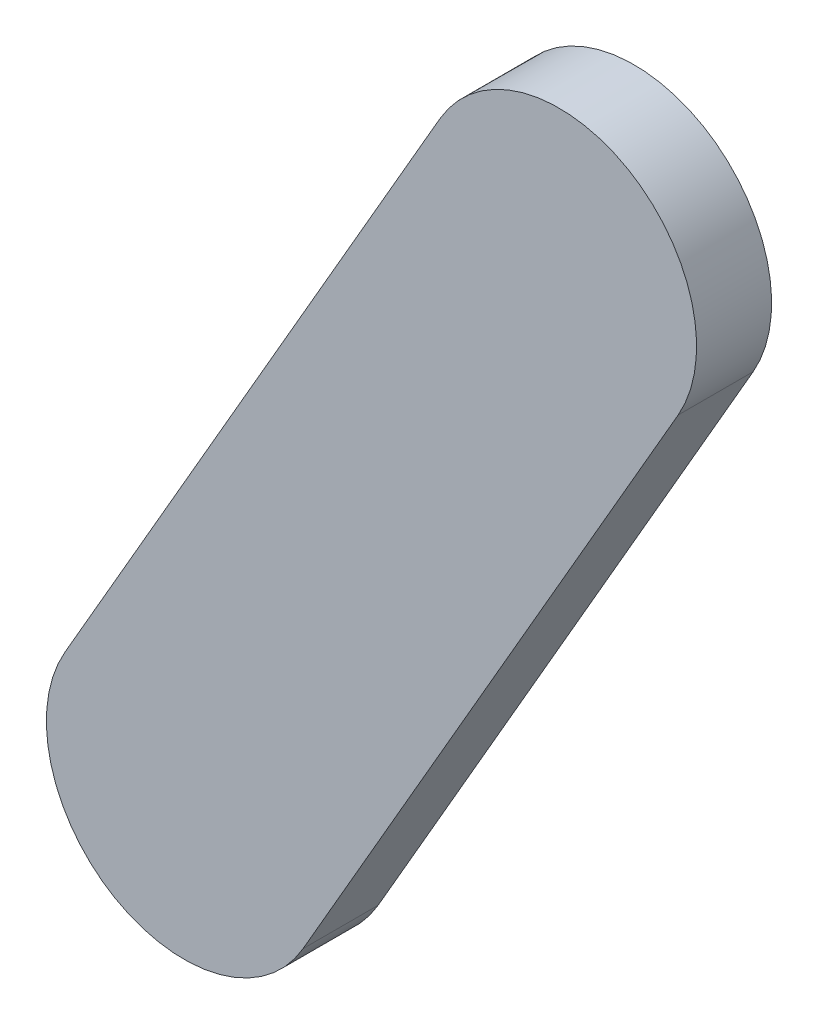
ISO-10303-21;
HEADER;
FILE_DESCRIPTION(('STEP AP214'),'2;1');
FILE_NAME('part.step','',(''),(''),'','','');
FILE_SCHEMA(('AUTOMOTIVE_DESIGN { 1 0 10303 214 1 1 1 1 }'));
ENDSEC;
DATA;
#1=APPLICATION_CONTEXT('core data for automotive mechanical design processes');
#2=APPLICATION_PROTOCOL_DEFINITION('international standard','automotive_design',2000,#1);
#3=PRODUCT_CONTEXT('',#1,'mechanical');
#4=PRODUCT('Part','Part','',(#3));
#5=PRODUCT_RELATED_PRODUCT_CATEGORY('part','',(#4));
#6=PRODUCT_DEFINITION_FORMATION('','',#4);
#7=PRODUCT_DEFINITION_CONTEXT('part definition',#1,'design');
#8=PRODUCT_DEFINITION('design','',#6,#7);
#9=PRODUCT_DEFINITION_SHAPE('','',#8);
#10=(LENGTH_UNIT() NAMED_UNIT(*) SI_UNIT(.MILLI.,.METRE.));
#11=(NAMED_UNIT(*) PLANE_ANGLE_UNIT() SI_UNIT($,.RADIAN.));
#12=(NAMED_UNIT(*) SI_UNIT($,.STERADIAN.) SOLID_ANGLE_UNIT());
#13=UNCERTAINTY_MEASURE_WITH_UNIT(LENGTH_MEASURE(1.E-05),#10,'distance_accuracy_value','');
#14=(GEOMETRIC_REPRESENTATION_CONTEXT(3) GLOBAL_UNCERTAINTY_ASSIGNED_CONTEXT((#13)) GLOBAL_UNIT_ASSIGNED_CONTEXT((#10,
#11,#12)) REPRESENTATION_CONTEXT('',''));
#15=CARTESIAN_POINT('',(0.,0.,0.));
#16=DIRECTION('',(0.,0.,1.));
#17=DIRECTION('',(1.,0.,0.));
#18=AXIS2_PLACEMENT_3D('',#15,#16,#17);
#19=CARTESIAN_POINT('',(0.,0.,1.5));
#20=DIRECTION('',(0.,0.,-1.));
#21=DIRECTION('',(-1.,0.,0.));
#22=AXIS2_PLACEMENT_3D('',#19,#20,#21);
#23=CYLINDRICAL_SURFACE('',#22,5.5);
#24=CARTESIAN_POINT('',(0.,0.,-1.5));
#25=DIRECTION('',(0.,0.,1.));
#26=DIRECTION('',(1.,0.,0.));
#27=AXIS2_PLACEMENT_3D('',#24,#25,#26);
#28=CIRCLE('',#27,5.5);
#29=CARTESIAN_POINT('',(-4.7631397208144,2.75000000000002,-1.5));
#30=VERTEX_POINT('',#29);
#31=CARTESIAN_POINT('',(4.7631397208144,-2.75000000000002,-1.5));
#32=VERTEX_POINT('',#31);
#33=EDGE_CURVE('E102',#30,#32,#28,.T.);
#34=ORIENTED_EDGE('',*,*,#33,.T.);
#35=DIRECTION('',(0.,0.,-1.));
#36=VECTOR('',#35,1.);
#37=CARTESIAN_POINT('',(4.7631397208144,-2.75000000000002,1.5));
#38=LINE('',#37,#36);
#39=CARTESIAN_POINT('',(4.7631397208144,-2.75000000000002,1.5));
#40=VERTEX_POINT('',#39);
#41=EDGE_CURVE('E11',#40,#32,#38,.T.);
#42=ORIENTED_EDGE('',*,*,#41,.F.);
#43=CARTESIAN_POINT('',(0.,0.,1.5));
#44=DIRECTION('',(0.,0.,1.));
#45=DIRECTION('',(1.,0.,0.));
#46=AXIS2_PLACEMENT_3D('',#43,#44,#45);
#47=CIRCLE('',#46,5.5);
#48=CARTESIAN_POINT('',(-4.7631397208144,2.75000000000002,1.5));
#49=VERTEX_POINT('',#48);
#50=EDGE_CURVE('E88',#49,#40,#47,.T.);
#51=ORIENTED_EDGE('',*,*,#50,.F.);
#52=DIRECTION('',(0.,0.,-1.));
#53=VECTOR('',#52,1.);
#54=CARTESIAN_POINT('',(-4.7631397208144,2.75000000000002,1.5));
#55=LINE('',#54,#53);
#56=EDGE_CURVE('E55',#49,#30,#55,.T.);
#57=ORIENTED_EDGE('',*,*,#56,.T.);
#58=EDGE_LOOP('',(#34,#42,#51,#57));
#59=FACE_BOUND('',#58,.T.);
#60=ADVANCED_FACE('F39',(#59),#23,.T.);
#61=CARTESIAN_POINT('',(4.7631397208144,-2.75000000000002,1.5));
#62=DIRECTION('',(-0.866025403784436,0.500000000000004,0.));
#63=DIRECTION('',(-0.500000000000004,-0.866025403784436,0.));
#64=AXIS2_PLACEMENT_3D('',#61,#62,#63);
#65=PLANE('',#64);
#66=DIRECTION('',(0.500000000000004,0.866025403784436,0.));
#67=VECTOR('',#66,1.);
#68=CARTESIAN_POINT('',(4.7631397208144,-2.75000000000002,-1.5));
#69=LINE('',#68,#67);
#70=CARTESIAN_POINT('',(19.7631397208145,23.2307621135331,-1.5));
#71=VERTEX_POINT('',#70);
#72=EDGE_CURVE('E93',#32,#71,#69,.T.);
#73=ORIENTED_EDGE('',*,*,#72,.T.);
#74=DIRECTION('',(0.,0.,-1.));
#75=VECTOR('',#74,1.);
#76=CARTESIAN_POINT('',(19.7631397208145,23.2307621135331,1.5));
#77=LINE('',#76,#75);
#78=CARTESIAN_POINT('',(19.7631397208145,23.2307621135331,1.5));
#79=VERTEX_POINT('',#78);
#80=EDGE_CURVE('E47',#79,#71,#77,.T.);
#81=ORIENTED_EDGE('',*,*,#80,.F.);
#82=DIRECTION('',(0.500000000000004,0.866025403784436,0.));
#83=VECTOR('',#82,1.);
#84=CARTESIAN_POINT('',(4.7631397208144,-2.75000000000002,1.5));
#85=LINE('',#84,#83);
#86=EDGE_CURVE('E81',#40,#79,#85,.T.);
#87=ORIENTED_EDGE('',*,*,#86,.F.);
#88=ORIENTED_EDGE('',*,*,#41,.T.);
#89=EDGE_LOOP('',(#73,#81,#87,#88));
#90=FACE_BOUND('',#89,.T.);
#91=ADVANCED_FACE('F92',(#90),#65,.F.);
#92=CARTESIAN_POINT('',(15.0000000000001,25.9807621135331,1.5));
#93=DIRECTION('',(0.,0.,-1.));
#94=DIRECTION('',(-1.,0.,0.));
#95=AXIS2_PLACEMENT_3D('',#92,#93,#94);
#96=CYLINDRICAL_SURFACE('',#95,5.5);
#97=CARTESIAN_POINT('',(15.0000000000001,25.9807621135331,-1.5));
#98=DIRECTION('',(0.,0.,1.));
#99=DIRECTION('',(1.,0.,0.));
#100=AXIS2_PLACEMENT_3D('',#97,#98,#99);
#101=CIRCLE('',#100,5.5);
#102=CARTESIAN_POINT('',(10.2368602791857,28.7307621135331,-1.5));
#103=VERTEX_POINT('',#102);
#104=EDGE_CURVE('E105',#71,#103,#101,.T.);
#105=ORIENTED_EDGE('',*,*,#104,.T.);
#106=DIRECTION('',(0.,0.,-1.));
#107=VECTOR('',#106,1.);
#108=CARTESIAN_POINT('',(10.2368602791857,28.7307621135331,1.5));
#109=LINE('',#108,#107);
#110=CARTESIAN_POINT('',(10.2368602791857,28.7307621135331,1.5));
#111=VERTEX_POINT('',#110);
#112=EDGE_CURVE('E70',#111,#103,#109,.T.);
#113=ORIENTED_EDGE('',*,*,#112,.F.);
#114=CARTESIAN_POINT('',(15.0000000000001,25.9807621135331,1.5));
#115=DIRECTION('',(0.,0.,1.));
#116=DIRECTION('',(1.,0.,0.));
#117=AXIS2_PLACEMENT_3D('',#114,#115,#116);
#118=CIRCLE('',#117,5.5);
#119=EDGE_CURVE('E87',#79,#111,#118,.T.);
#120=ORIENTED_EDGE('',*,*,#119,.F.);
#121=ORIENTED_EDGE('',*,*,#80,.T.);
#122=EDGE_LOOP('',(#105,#113,#120,#121));
#123=FACE_BOUND('',#122,.T.);
#124=ADVANCED_FACE('F96',(#123),#96,.T.);
#125=CARTESIAN_POINT('',(-4.7631397208144,2.75000000000002,1.5));
#126=DIRECTION('',(-0.866025403784436,0.500000000000004,0.));
#127=DIRECTION('',(-0.500000000000004,-0.866025403784436,0.));
#128=AXIS2_PLACEMENT_3D('',#125,#126,#127);
#129=PLANE('',#128);
#130=DIRECTION('',(0.500000000000004,0.866025403784436,0.));
#131=VECTOR('',#130,1.);
#132=CARTESIAN_POINT('',(-4.7631397208144,2.75000000000002,-1.5));
#133=LINE('',#132,#131);
#134=EDGE_CURVE('E107',#30,#103,#133,.T.);
#135=ORIENTED_EDGE('',*,*,#134,.F.);
#136=ORIENTED_EDGE('',*,*,#56,.F.);
#137=DIRECTION('',(0.500000000000004,0.866025403784436,0.));
#138=VECTOR('',#137,1.);
#139=CARTESIAN_POINT('',(-4.7631397208144,2.75000000000002,1.5));
#140=LINE('',#139,#138);
#141=EDGE_CURVE('E97',#49,#111,#140,.T.);
#142=ORIENTED_EDGE('',*,*,#141,.T.);
#143=ORIENTED_EDGE('',*,*,#112,.T.);
#144=EDGE_LOOP('',(#135,#136,#142,#143));
#145=FACE_BOUND('',#144,.T.);
#146=ADVANCED_FACE('F113',(#145),#129,.T.);
#147=CARTESIAN_POINT('',(0.,0.,1.5));
#148=DIRECTION('',(0.,0.,1.));
#149=DIRECTION('',(1.,0.,0.));
#150=AXIS2_PLACEMENT_3D('',#147,#148,#149);
#151=PLANE('',#150);
#152=ORIENTED_EDGE('',*,*,#50,.T.);
#153=ORIENTED_EDGE('',*,*,#86,.T.);
#154=ORIENTED_EDGE('',*,*,#119,.T.);
#155=ORIENTED_EDGE('',*,*,#141,.F.);
#156=EDGE_LOOP('',(#152,#153,#154,#155));
#157=FACE_BOUND('',#156,.T.);
#158=ADVANCED_FACE('F84',(#157),#151,.T.);
#159=CARTESIAN_POINT('',(0.,0.,-1.5));
#160=DIRECTION('',(0.,0.,1.));
#161=DIRECTION('',(1.,0.,0.));
#162=AXIS2_PLACEMENT_3D('',#159,#160,#161);
#163=PLANE('',#162);
#164=ORIENTED_EDGE('',*,*,#33,.F.);
#165=ORIENTED_EDGE('',*,*,#134,.T.);
#166=ORIENTED_EDGE('',*,*,#104,.F.);
#167=ORIENTED_EDGE('',*,*,#72,.F.);
#168=EDGE_LOOP('',(#164,#165,#166,#167));
#169=FACE_BOUND('',#168,.T.);
#170=ADVANCED_FACE('F112',(#169),#163,.F.);
#171=CLOSED_SHELL('',(#60,#91,#124,#146,#158,#170));
#172=MANIFOLD_SOLID_BREP('B2',#171);
#173=ADVANCED_BREP_SHAPE_REPRESENTATION('',(#18,#172),#14);
#174=SHAPE_DEFINITION_REPRESENTATION(#9,#173);
ENDSEC;
END-ISO-10303-21;
